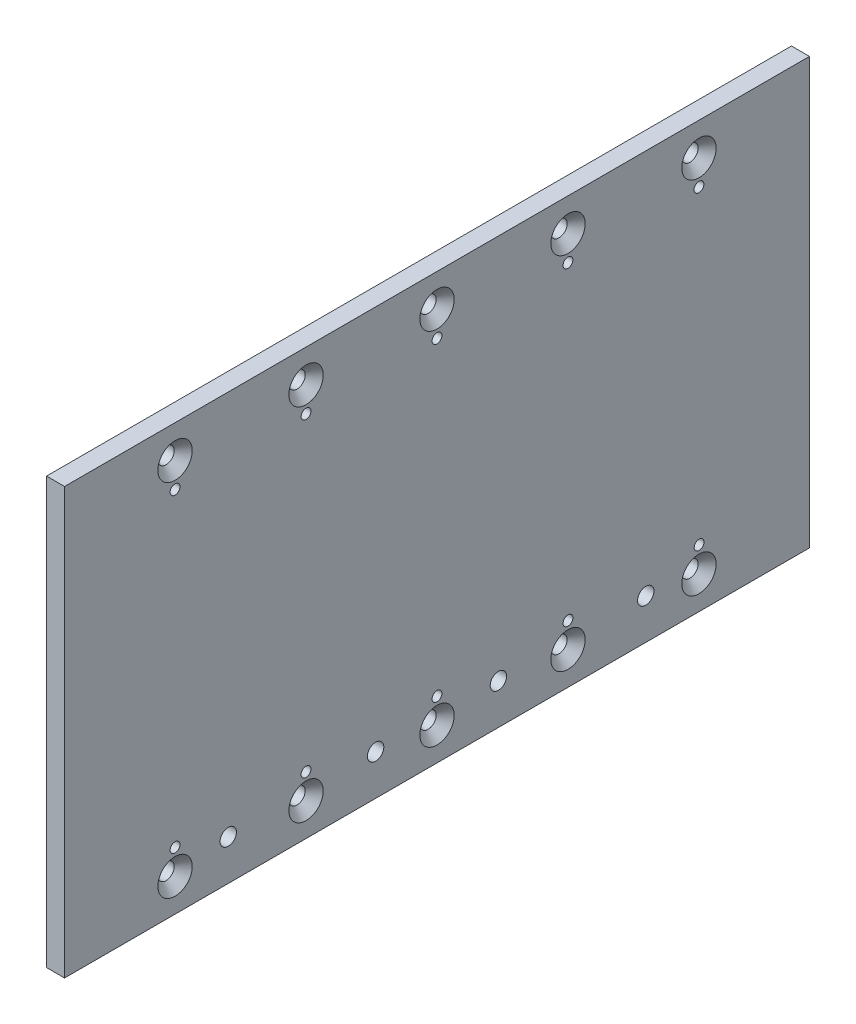
ISO-10303-21;
HEADER;
FILE_DESCRIPTION(('STEP AP214'),'2;1');
FILE_NAME('part.step','',(''),(''),'','','');
FILE_SCHEMA(('AUTOMOTIVE_DESIGN { 1 0 10303 214 1 1 1 1 }'));
ENDSEC;
DATA;
#1=APPLICATION_CONTEXT('core data for automotive mechanical design processes');
#2=APPLICATION_PROTOCOL_DEFINITION('international standard','automotive_design',2000,#1);
#3=PRODUCT_CONTEXT('',#1,'mechanical');
#4=PRODUCT('Part','Part','',(#3));
#5=PRODUCT_RELATED_PRODUCT_CATEGORY('part','',(#4));
#6=PRODUCT_DEFINITION_FORMATION('','',#4);
#7=PRODUCT_DEFINITION_CONTEXT('part definition',#1,'design');
#8=PRODUCT_DEFINITION('design','',#6,#7);
#9=PRODUCT_DEFINITION_SHAPE('','',#8);
#10=(LENGTH_UNIT() NAMED_UNIT(*) SI_UNIT(.MILLI.,.METRE.));
#11=(NAMED_UNIT(*) PLANE_ANGLE_UNIT() SI_UNIT($,.RADIAN.));
#12=(NAMED_UNIT(*) SI_UNIT($,.STERADIAN.) SOLID_ANGLE_UNIT());
#13=UNCERTAINTY_MEASURE_WITH_UNIT(LENGTH_MEASURE(1.E-05),#10,'distance_accuracy_value','');
#14=(GEOMETRIC_REPRESENTATION_CONTEXT(3) GLOBAL_UNCERTAINTY_ASSIGNED_CONTEXT((#13)) GLOBAL_UNIT_ASSIGNED_CONTEXT((#10,
#11,#12)) REPRESENTATION_CONTEXT('',''));
#15=CARTESIAN_POINT('',(0.,0.,0.));
#16=DIRECTION('',(0.,0.,1.));
#17=DIRECTION('',(1.,0.,0.));
#18=AXIS2_PLACEMENT_3D('',#15,#16,#17);
#19=CARTESIAN_POINT('',(5.5,-65.,113.75));
#20=DIRECTION('',(0.,0.,-1.));
#21=DIRECTION('',(-1.,0.,0.));
#22=AXIS2_PLACEMENT_3D('',#19,#20,#21);
#23=PLANE('',#22);
#24=DIRECTION('',(0.,-1.,0.));
#25=VECTOR('',#24,1.);
#26=CARTESIAN_POINT('',(0.,-65.,113.75));
#27=LINE('',#26,#25);
#28=CARTESIAN_POINT('',(0.,65.,113.75));
#29=VERTEX_POINT('',#28);
#30=CARTESIAN_POINT('',(0.,-65.,113.75));
#31=VERTEX_POINT('',#30);
#32=EDGE_CURVE('E108',#29,#31,#27,.T.);
#33=ORIENTED_EDGE('',*,*,#32,.T.);
#34=DIRECTION('',(-1.,0.,0.));
#35=VECTOR('',#34,1.);
#36=CARTESIAN_POINT('',(5.5,-65.,113.75));
#37=LINE('',#36,#35);
#38=CARTESIAN_POINT('',(5.5,-65.,113.75));
#39=VERTEX_POINT('',#38);
#40=EDGE_CURVE('E13',#39,#31,#37,.T.);
#41=ORIENTED_EDGE('',*,*,#40,.F.);
#42=DIRECTION('',(0.,-1.,0.));
#43=VECTOR('',#42,1.);
#44=CARTESIAN_POINT('',(5.5,-65.,113.75));
#45=LINE('',#44,#43);
#46=CARTESIAN_POINT('',(5.5,65.,113.75));
#47=VERTEX_POINT('',#46);
#48=EDGE_CURVE('E96',#47,#39,#45,.T.);
#49=ORIENTED_EDGE('',*,*,#48,.F.);
#50=DIRECTION('',(-1.,0.,0.));
#51=VECTOR('',#50,1.);
#52=CARTESIAN_POINT('',(5.5,65.,113.75));
#53=LINE('',#52,#51);
#54=EDGE_CURVE('E104',#47,#29,#53,.T.);
#55=ORIENTED_EDGE('',*,*,#54,.T.);
#56=EDGE_LOOP('',(#33,#41,#49,#55));
#57=FACE_BOUND('',#56,.T.);
#58=ADVANCED_FACE('F45',(#57),#23,.F.);
#59=CARTESIAN_POINT('',(5.5,-65.,-113.75));
#60=DIRECTION('',(0.,1.,0.));
#61=DIRECTION('',(0.,0.,1.));
#62=AXIS2_PLACEMENT_3D('',#59,#60,#61);
#63=PLANE('',#62);
#64=DIRECTION('',(0.,0.,-1.));
#65=VECTOR('',#64,1.);
#66=CARTESIAN_POINT('',(0.,-65.,-113.75));
#67=LINE('',#66,#65);
#68=CARTESIAN_POINT('',(0.,-65.,-113.75));
#69=VERTEX_POINT('',#68);
#70=EDGE_CURVE('E100',#31,#69,#67,.T.);
#71=ORIENTED_EDGE('',*,*,#70,.T.);
#72=DIRECTION('',(-1.,0.,0.));
#73=VECTOR('',#72,1.);
#74=CARTESIAN_POINT('',(5.5,-65.,-113.75));
#75=LINE('',#74,#73);
#76=CARTESIAN_POINT('',(5.5,-65.,-113.75));
#77=VERTEX_POINT('',#76);
#78=EDGE_CURVE('E53',#77,#69,#75,.T.);
#79=ORIENTED_EDGE('',*,*,#78,.F.);
#80=DIRECTION('',(0.,0.,-1.));
#81=VECTOR('',#80,1.);
#82=CARTESIAN_POINT('',(5.5,-65.,-113.75));
#83=LINE('',#82,#81);
#84=EDGE_CURVE('E91',#39,#77,#83,.T.);
#85=ORIENTED_EDGE('',*,*,#84,.F.);
#86=ORIENTED_EDGE('',*,*,#40,.T.);
#87=EDGE_LOOP('',(#71,#79,#85,#86));
#88=FACE_BOUND('',#87,.T.);
#89=ADVANCED_FACE('F99',(#88),#63,.F.);
#90=CARTESIAN_POINT('',(5.5,-65.,-113.75));
#91=DIRECTION('',(0.,0.,1.));
#92=DIRECTION('',(1.,0.,0.));
#93=AXIS2_PLACEMENT_3D('',#90,#91,#92);
#94=PLANE('',#93);
#95=DIRECTION('',(0.,1.,0.));
#96=VECTOR('',#95,1.);
#97=CARTESIAN_POINT('',(0.,-65.,-113.75));
#98=LINE('',#97,#96);
#99=CARTESIAN_POINT('',(0.,65.,-113.75));
#100=VERTEX_POINT('',#99);
#101=EDGE_CURVE('E78',#69,#100,#98,.T.);
#102=ORIENTED_EDGE('',*,*,#101,.T.);
#103=DIRECTION('',(-1.,0.,0.));
#104=VECTOR('',#103,1.);
#105=CARTESIAN_POINT('',(5.5,65.,-113.75));
#106=LINE('',#105,#104);
#107=CARTESIAN_POINT('',(5.5,65.,-113.75));
#108=VERTEX_POINT('',#107);
#109=EDGE_CURVE('E101',#108,#100,#106,.T.);
#110=ORIENTED_EDGE('',*,*,#109,.F.);
#111=DIRECTION('',(0.,1.,0.));
#112=VECTOR('',#111,1.);
#113=CARTESIAN_POINT('',(5.5,-65.,-113.75));
#114=LINE('',#113,#112);
#115=EDGE_CURVE('E94',#77,#108,#114,.T.);
#116=ORIENTED_EDGE('',*,*,#115,.F.);
#117=ORIENTED_EDGE('',*,*,#78,.T.);
#118=EDGE_LOOP('',(#102,#110,#116,#117));
#119=FACE_BOUND('',#118,.T.);
#120=ADVANCED_FACE('F102',(#119),#94,.F.);
#121=CARTESIAN_POINT('',(5.5,65.,-113.75));
#122=DIRECTION('',(0.,-1.,0.));
#123=DIRECTION('',(0.,0.,-1.));
#124=AXIS2_PLACEMENT_3D('',#121,#122,#123);
#125=PLANE('',#124);
#126=DIRECTION('',(0.,0.,1.));
#127=VECTOR('',#126,1.);
#128=CARTESIAN_POINT('',(0.,65.,-113.75));
#129=LINE('',#128,#127);
#130=EDGE_CURVE('E84',#100,#29,#129,.T.);
#131=ORIENTED_EDGE('',*,*,#130,.T.);
#132=ORIENTED_EDGE('',*,*,#54,.F.);
#133=DIRECTION('',(0.,0.,1.));
#134=VECTOR('',#133,1.);
#135=CARTESIAN_POINT('',(5.5,65.,-113.75));
#136=LINE('',#135,#134);
#137=EDGE_CURVE('E61',#108,#47,#136,.T.);
#138=ORIENTED_EDGE('',*,*,#137,.F.);
#139=ORIENTED_EDGE('',*,*,#109,.T.);
#140=EDGE_LOOP('',(#131,#132,#138,#139));
#141=FACE_BOUND('',#140,.T.);
#142=ADVANCED_FACE('F116',(#141),#125,.F.);
#143=CARTESIAN_POINT('',(5.5,0.,0.));
#144=DIRECTION('',(1.,0.,0.));
#145=DIRECTION('',(0.,0.,-1.));
#146=AXIS2_PLACEMENT_3D('',#143,#144,#145);
#147=PLANE('',#146);
#148=CARTESIAN_POINT('',(5.5,47.3325000000011,80.));
#149=DIRECTION('',(1.,0.,0.));
#150=DIRECTION('',(0.,0.,-1.));
#151=AXIS2_PLACEMENT_3D('',#148,#149,#150);
#152=CIRCLE('',#151,1.50000000000003);
#153=CARTESIAN_POINT('',(5.5,47.3325000000011,78.5));
#154=VERTEX_POINT('',#153);
#155=EDGE_CURVE('E289',#154,#154,#152,.T.);
#156=ORIENTED_EDGE('',*,*,#155,.F.);
#157=EDGE_LOOP('',(#156));
#158=FACE_BOUND('',#157,.T.);
#159=CARTESIAN_POINT('',(5.5,47.3325000000008,40.));
#160=DIRECTION('',(1.,0.,0.));
#161=DIRECTION('',(0.,0.,-1.));
#162=AXIS2_PLACEMENT_3D('',#159,#160,#161);
#163=CIRCLE('',#162,1.50000000000003);
#164=CARTESIAN_POINT('',(5.5,47.3325000000008,38.5));
#165=VERTEX_POINT('',#164);
#166=EDGE_CURVE('E283',#165,#165,#163,.T.);
#167=ORIENTED_EDGE('',*,*,#166,.F.);
#168=EDGE_LOOP('',(#167));
#169=FACE_BOUND('',#168,.T.);
#170=CARTESIAN_POINT('',(5.5,47.3325000000006,0.));
#171=DIRECTION('',(1.,0.,0.));
#172=DIRECTION('',(0.,0.,-1.));
#173=AXIS2_PLACEMENT_3D('',#170,#171,#172);
#174=CIRCLE('',#173,1.50000000000002);
#175=CARTESIAN_POINT('',(5.5,47.3325000000006,-1.50000000000001));
#176=VERTEX_POINT('',#175);
#177=EDGE_CURVE('E277',#176,#176,#174,.T.);
#178=ORIENTED_EDGE('',*,*,#177,.F.);
#179=EDGE_LOOP('',(#178));
#180=FACE_BOUND('',#179,.T.);
#181=CARTESIAN_POINT('',(5.5,47.3325000000003,-40.));
#182=DIRECTION('',(1.,0.,0.));
#183=DIRECTION('',(0.,0.,-1.));
#184=AXIS2_PLACEMENT_3D('',#181,#182,#183);
#185=CIRCLE('',#184,1.50000000000003);
#186=CARTESIAN_POINT('',(5.5,47.3325000000003,-41.5));
#187=VERTEX_POINT('',#186);
#188=EDGE_CURVE('E271',#187,#187,#185,.T.);
#189=ORIENTED_EDGE('',*,*,#188,.F.);
#190=EDGE_LOOP('',(#189));
#191=FACE_BOUND('',#190,.T.);
#192=CARTESIAN_POINT('',(5.5,47.3325,-80.));
#193=DIRECTION('',(1.,0.,0.));
#194=DIRECTION('',(0.,0.,-1.));
#195=AXIS2_PLACEMENT_3D('',#192,#193,#194);
#196=CIRCLE('',#195,1.50000000000003);
#197=CARTESIAN_POINT('',(5.5,47.3325,-81.5));
#198=VERTEX_POINT('',#197);
#199=EDGE_CURVE('E265',#198,#198,#196,.T.);
#200=ORIENTED_EDGE('',*,*,#199,.F.);
#201=EDGE_LOOP('',(#200));
#202=FACE_BOUND('',#201,.T.);
#203=CARTESIAN_POINT('',(5.5,-47.3325,80.));
#204=DIRECTION('',(1.,0.,0.));
#205=DIRECTION('',(0.,0.,-1.));
#206=AXIS2_PLACEMENT_3D('',#203,#204,#205);
#207=CIRCLE('',#206,1.5);
#208=CARTESIAN_POINT('',(5.5,-47.3325,78.5));
#209=VERTEX_POINT('',#208);
#210=EDGE_CURVE('E259',#209,#209,#207,.T.);
#211=ORIENTED_EDGE('',*,*,#210,.F.);
#212=EDGE_LOOP('',(#211));
#213=FACE_BOUND('',#212,.T.);
#214=CARTESIAN_POINT('',(5.5,-47.3325,40.));
#215=DIRECTION('',(1.,0.,0.));
#216=DIRECTION('',(0.,0.,-1.));
#217=AXIS2_PLACEMENT_3D('',#214,#215,#216);
#218=CIRCLE('',#217,1.50000000000003);
#219=CARTESIAN_POINT('',(5.5,-47.3325,38.5));
#220=VERTEX_POINT('',#219);
#221=EDGE_CURVE('E253',#220,#220,#218,.T.);
#222=ORIENTED_EDGE('',*,*,#221,.F.);
#223=EDGE_LOOP('',(#222));
#224=FACE_BOUND('',#223,.T.);
#225=CARTESIAN_POINT('',(5.5,-47.3325,0.));
#226=DIRECTION('',(1.,0.,0.));
#227=DIRECTION('',(0.,0.,-1.));
#228=AXIS2_PLACEMENT_3D('',#225,#226,#227);
#229=CIRCLE('',#228,1.5);
#230=CARTESIAN_POINT('',(5.5,-47.3325,-1.5));
#231=VERTEX_POINT('',#230);
#232=EDGE_CURVE('E247',#231,#231,#229,.T.);
#233=ORIENTED_EDGE('',*,*,#232,.F.);
#234=EDGE_LOOP('',(#233));
#235=FACE_BOUND('',#234,.T.);
#236=CARTESIAN_POINT('',(5.5,-47.3325,-40.));
#237=DIRECTION('',(1.,0.,0.));
#238=DIRECTION('',(0.,0.,-1.));
#239=AXIS2_PLACEMENT_3D('',#236,#237,#238);
#240=CIRCLE('',#239,1.5);
#241=CARTESIAN_POINT('',(5.5,-47.3325,-41.5));
#242=VERTEX_POINT('',#241);
#243=EDGE_CURVE('E241',#242,#242,#240,.T.);
#244=ORIENTED_EDGE('',*,*,#243,.F.);
#245=EDGE_LOOP('',(#244));
#246=FACE_BOUND('',#245,.T.);
#247=CARTESIAN_POINT('',(5.5,-47.3325,-80.045792535828));
#248=DIRECTION('',(1.,0.,0.));
#249=DIRECTION('',(0.,0.,-1.));
#250=AXIS2_PLACEMENT_3D('',#247,#248,#249);
#251=CIRCLE('',#250,1.5);
#252=CARTESIAN_POINT('',(5.5,-47.3325,-81.545792535828));
#253=VERTEX_POINT('',#252);
#254=EDGE_CURVE('E235',#253,#253,#251,.T.);
#255=ORIENTED_EDGE('',*,*,#254,.F.);
#256=EDGE_LOOP('',(#255));
#257=FACE_BOUND('',#256,.T.);
#258=CARTESIAN_POINT('',(5.5,-52.6538368417559,63.75));
#259=DIRECTION('',(1.,0.,0.));
#260=DIRECTION('',(0.,0.,-1.));
#261=AXIS2_PLACEMENT_3D('',#258,#259,#260);
#262=CIRCLE('',#261,2.49999999999999);
#263=CARTESIAN_POINT('',(5.5,-52.6538368417559,61.25));
#264=VERTEX_POINT('',#263);
#265=EDGE_CURVE('E232',#264,#264,#262,.T.);
#266=ORIENTED_EDGE('',*,*,#265,.F.);
#267=EDGE_LOOP('',(#266));
#268=FACE_BOUND('',#267,.T.);
#269=CARTESIAN_POINT('',(5.5,-52.6538368417559,18.75));
#270=DIRECTION('',(1.,0.,0.));
#271=DIRECTION('',(0.,0.,-1.));
#272=AXIS2_PLACEMENT_3D('',#269,#270,#271);
#273=CIRCLE('',#272,2.49999999999999);
#274=CARTESIAN_POINT('',(5.5,-52.6538368417559,16.2500000000001));
#275=VERTEX_POINT('',#274);
#276=EDGE_CURVE('E226',#275,#275,#273,.T.);
#277=ORIENTED_EDGE('',*,*,#276,.F.);
#278=EDGE_LOOP('',(#277));
#279=FACE_BOUND('',#278,.T.);
#280=CARTESIAN_POINT('',(5.5,-52.6538368417559,-18.75));
#281=DIRECTION('',(1.,0.,0.));
#282=DIRECTION('',(0.,0.,-1.));
#283=AXIS2_PLACEMENT_3D('',#280,#281,#282);
#284=CIRCLE('',#283,2.49999999999999);
#285=CARTESIAN_POINT('',(5.5,-52.6538368417559,-21.25));
#286=VERTEX_POINT('',#285);
#287=EDGE_CURVE('E220',#286,#286,#284,.T.);
#288=ORIENTED_EDGE('',*,*,#287,.F.);
#289=EDGE_LOOP('',(#288));
#290=FACE_BOUND('',#289,.T.);
#291=CARTESIAN_POINT('',(5.5,-52.6538368417559,-63.75));
#292=DIRECTION('',(1.,0.,0.));
#293=DIRECTION('',(0.,0.,-1.));
#294=AXIS2_PLACEMENT_3D('',#291,#292,#293);
#295=CIRCLE('',#294,2.49999999999999);
#296=CARTESIAN_POINT('',(5.5,-52.6538368417559,-66.2499999999999));
#297=VERTEX_POINT('',#296);
#298=EDGE_CURVE('E214',#297,#297,#295,.T.);
#299=ORIENTED_EDGE('',*,*,#298,.F.);
#300=EDGE_LOOP('',(#299));
#301=FACE_BOUND('',#300,.T.);
#302=CARTESIAN_POINT('',(5.5,55.,-80.));
#303=DIRECTION('',(1.,0.,0.));
#304=DIRECTION('',(0.,0.,-1.));
#305=AXIS2_PLACEMENT_3D('',#302,#303,#304);
#306=CIRCLE('',#305,5.25);
#307=CARTESIAN_POINT('',(5.5,55.,-85.25));
#308=VERTEX_POINT('',#307);
#309=EDGE_CURVE('E208',#308,#308,#306,.T.);
#310=ORIENTED_EDGE('',*,*,#309,.F.);
#311=EDGE_LOOP('',(#310));
#312=FACE_BOUND('',#311,.T.);
#313=CARTESIAN_POINT('',(5.5,55.,-40.));
#314=DIRECTION('',(1.,0.,0.));
#315=DIRECTION('',(0.,0.,-1.));
#316=AXIS2_PLACEMENT_3D('',#313,#314,#315);
#317=CIRCLE('',#316,5.25);
#318=CARTESIAN_POINT('',(5.5,55.,-45.25));
#319=VERTEX_POINT('',#318);
#320=EDGE_CURVE('E199',#319,#319,#317,.T.);
#321=ORIENTED_EDGE('',*,*,#320,.F.);
#322=EDGE_LOOP('',(#321));
#323=FACE_BOUND('',#322,.T.);
#324=CARTESIAN_POINT('',(5.5,55.,0.));
#325=DIRECTION('',(1.,0.,0.));
#326=DIRECTION('',(0.,0.,-1.));
#327=AXIS2_PLACEMENT_3D('',#324,#325,#326);
#328=CIRCLE('',#327,5.25);
#329=CARTESIAN_POINT('',(5.5,55.,-5.25));
#330=VERTEX_POINT('',#329);
#331=EDGE_CURVE('E190',#330,#330,#328,.T.);
#332=ORIENTED_EDGE('',*,*,#331,.F.);
#333=EDGE_LOOP('',(#332));
#334=FACE_BOUND('',#333,.T.);
#335=CARTESIAN_POINT('',(5.5,54.9999999999999,40.));
#336=DIRECTION('',(1.,0.,0.));
#337=DIRECTION('',(0.,0.,-1.));
#338=AXIS2_PLACEMENT_3D('',#335,#336,#337);
#339=CIRCLE('',#338,5.25);
#340=CARTESIAN_POINT('',(5.5,54.9999999999999,34.75));
#341=VERTEX_POINT('',#340);
#342=EDGE_CURVE('E181',#341,#341,#339,.T.);
#343=ORIENTED_EDGE('',*,*,#342,.F.);
#344=EDGE_LOOP('',(#343));
#345=FACE_BOUND('',#344,.T.);
#346=CARTESIAN_POINT('',(5.5,54.9999999999999,80.));
#347=DIRECTION('',(1.,0.,0.));
#348=DIRECTION('',(0.,0.,-1.));
#349=AXIS2_PLACEMENT_3D('',#346,#347,#348);
#350=CIRCLE('',#349,5.25);
#351=CARTESIAN_POINT('',(5.5,54.9999999999999,74.75));
#352=VERTEX_POINT('',#351);
#353=EDGE_CURVE('E172',#352,#352,#350,.T.);
#354=ORIENTED_EDGE('',*,*,#353,.F.);
#355=EDGE_LOOP('',(#354));
#356=FACE_BOUND('',#355,.T.);
#357=CARTESIAN_POINT('',(5.5,-55.0000000000001,80.));
#358=DIRECTION('',(1.,0.,0.));
#359=DIRECTION('',(0.,0.,-1.));
#360=AXIS2_PLACEMENT_3D('',#357,#358,#359);
#361=CIRCLE('',#360,5.25);
#362=CARTESIAN_POINT('',(5.5,-55.0000000000001,74.75));
#363=VERTEX_POINT('',#362);
#364=EDGE_CURVE('E163',#363,#363,#361,.T.);
#365=ORIENTED_EDGE('',*,*,#364,.F.);
#366=EDGE_LOOP('',(#365));
#367=FACE_BOUND('',#366,.T.);
#368=CARTESIAN_POINT('',(5.5,-55.0000000000001,40.));
#369=DIRECTION('',(1.,0.,0.));
#370=DIRECTION('',(0.,0.,-1.));
#371=AXIS2_PLACEMENT_3D('',#368,#369,#370);
#372=CIRCLE('',#371,5.25);
#373=CARTESIAN_POINT('',(5.5,-55.0000000000001,34.75));
#374=VERTEX_POINT('',#373);
#375=EDGE_CURVE('E154',#374,#374,#372,.T.);
#376=ORIENTED_EDGE('',*,*,#375,.F.);
#377=EDGE_LOOP('',(#376));
#378=FACE_BOUND('',#377,.T.);
#379=CARTESIAN_POINT('',(5.5,-55.0000000000001,0.));
#380=DIRECTION('',(1.,0.,0.));
#381=DIRECTION('',(0.,0.,-1.));
#382=AXIS2_PLACEMENT_3D('',#379,#380,#381);
#383=CIRCLE('',#382,5.25);
#384=CARTESIAN_POINT('',(5.5,-55.0000000000001,-5.25000000000001));
#385=VERTEX_POINT('',#384);
#386=EDGE_CURVE('E145',#385,#385,#383,.T.);
#387=ORIENTED_EDGE('',*,*,#386,.F.);
#388=EDGE_LOOP('',(#387));
#389=FACE_BOUND('',#388,.T.);
#390=CARTESIAN_POINT('',(5.5,-55.,-40.));
#391=DIRECTION('',(1.,0.,0.));
#392=DIRECTION('',(0.,0.,-1.));
#393=AXIS2_PLACEMENT_3D('',#390,#391,#392);
#394=CIRCLE('',#393,5.25);
#395=CARTESIAN_POINT('',(5.5,-55.,-45.25));
#396=VERTEX_POINT('',#395);
#397=EDGE_CURVE('E136',#396,#396,#394,.T.);
#398=ORIENTED_EDGE('',*,*,#397,.F.);
#399=EDGE_LOOP('',(#398));
#400=FACE_BOUND('',#399,.T.);
#401=CARTESIAN_POINT('',(5.5,-55.,-80.));
#402=DIRECTION('',(1.,0.,0.));
#403=DIRECTION('',(0.,0.,-1.));
#404=AXIS2_PLACEMENT_3D('',#401,#402,#403);
#405=CIRCLE('',#404,5.25);
#406=CARTESIAN_POINT('',(5.5,-55.,-85.25));
#407=VERTEX_POINT('',#406);
#408=EDGE_CURVE('E127',#407,#407,#405,.T.);
#409=ORIENTED_EDGE('',*,*,#408,.F.);
#410=EDGE_LOOP('',(#409));
#411=FACE_BOUND('',#410,.T.);
#412=ORIENTED_EDGE('',*,*,#48,.T.);
#413=ORIENTED_EDGE('',*,*,#84,.T.);
#414=ORIENTED_EDGE('',*,*,#115,.T.);
#415=ORIENTED_EDGE('',*,*,#137,.T.);
#416=EDGE_LOOP('',(#412,#413,#414,#415));
#417=FACE_BOUND('',#416,.T.);
#418=ADVANCED_FACE('F92',(#158,#169,#180,#191,#202,#213,#224,#235,#246,#257,#268,#279,#290,#301,
#312,#323,#334,#345,#356,#367,#378,#389,#400,#411,#417),#147,.T.);
#419=CARTESIAN_POINT('',(0.,0.,0.));
#420=DIRECTION('',(1.,0.,0.));
#421=DIRECTION('',(0.,0.,-1.));
#422=AXIS2_PLACEMENT_3D('',#419,#420,#421);
#423=PLANE('',#422);
#424=CARTESIAN_POINT('',(0.,47.3325000000011,80.));
#425=DIRECTION('',(-1.,0.,0.));
#426=DIRECTION('',(0.,0.,1.));
#427=AXIS2_PLACEMENT_3D('',#424,#425,#426);
#428=CIRCLE('',#427,1.50000000000003);
#429=CARTESIAN_POINT('',(0.,47.3325000000011,81.5));
#430=VERTEX_POINT('',#429);
#431=EDGE_CURVE('E292',#430,#430,#428,.T.);
#432=ORIENTED_EDGE('',*,*,#431,.F.);
#433=EDGE_LOOP('',(#432));
#434=FACE_BOUND('',#433,.T.);
#435=CARTESIAN_POINT('',(0.,47.3325000000008,40.));
#436=DIRECTION('',(-1.,0.,0.));
#437=DIRECTION('',(0.,0.,1.));
#438=AXIS2_PLACEMENT_3D('',#435,#436,#437);
#439=CIRCLE('',#438,1.50000000000003);
#440=CARTESIAN_POINT('',(0.,47.3325000000008,41.5));
#441=VERTEX_POINT('',#440);
#442=EDGE_CURVE('E286',#441,#441,#439,.T.);
#443=ORIENTED_EDGE('',*,*,#442,.F.);
#444=EDGE_LOOP('',(#443));
#445=FACE_BOUND('',#444,.T.);
#446=CARTESIAN_POINT('',(0.,47.3325000000006,0.));
#447=DIRECTION('',(-1.,0.,0.));
#448=DIRECTION('',(0.,0.,1.));
#449=AXIS2_PLACEMENT_3D('',#446,#447,#448);
#450=CIRCLE('',#449,1.50000000000002);
#451=CARTESIAN_POINT('',(0.,47.3325000000006,1.50000000000004));
#452=VERTEX_POINT('',#451);
#453=EDGE_CURVE('E280',#452,#452,#450,.T.);
#454=ORIENTED_EDGE('',*,*,#453,.F.);
#455=EDGE_LOOP('',(#454));
#456=FACE_BOUND('',#455,.T.);
#457=CARTESIAN_POINT('',(0.,47.3325000000003,-40.));
#458=DIRECTION('',(-1.,0.,0.));
#459=DIRECTION('',(0.,0.,1.));
#460=AXIS2_PLACEMENT_3D('',#457,#458,#459);
#461=CIRCLE('',#460,1.50000000000003);
#462=CARTESIAN_POINT('',(0.,47.3325000000003,-38.5));
#463=VERTEX_POINT('',#462);
#464=EDGE_CURVE('E274',#463,#463,#461,.T.);
#465=ORIENTED_EDGE('',*,*,#464,.F.);
#466=EDGE_LOOP('',(#465));
#467=FACE_BOUND('',#466,.T.);
#468=CARTESIAN_POINT('',(0.,47.3325,-80.));
#469=DIRECTION('',(-1.,0.,0.));
#470=DIRECTION('',(0.,0.,1.));
#471=AXIS2_PLACEMENT_3D('',#468,#469,#470);
#472=CIRCLE('',#471,1.50000000000003);
#473=CARTESIAN_POINT('',(0.,47.3325,-78.5));
#474=VERTEX_POINT('',#473);
#475=EDGE_CURVE('E268',#474,#474,#472,.T.);
#476=ORIENTED_EDGE('',*,*,#475,.F.);
#477=EDGE_LOOP('',(#476));
#478=FACE_BOUND('',#477,.T.);
#479=CARTESIAN_POINT('',(0.,-47.3325,80.));
#480=DIRECTION('',(-1.,0.,0.));
#481=DIRECTION('',(0.,0.,1.));
#482=AXIS2_PLACEMENT_3D('',#479,#480,#481);
#483=CIRCLE('',#482,1.5);
#484=CARTESIAN_POINT('',(0.,-47.3325,81.5));
#485=VERTEX_POINT('',#484);
#486=EDGE_CURVE('E262',#485,#485,#483,.T.);
#487=ORIENTED_EDGE('',*,*,#486,.F.);
#488=EDGE_LOOP('',(#487));
#489=FACE_BOUND('',#488,.T.);
#490=CARTESIAN_POINT('',(0.,-47.3325,40.));
#491=DIRECTION('',(-1.,0.,0.));
#492=DIRECTION('',(0.,0.,1.));
#493=AXIS2_PLACEMENT_3D('',#490,#491,#492);
#494=CIRCLE('',#493,1.50000000000003);
#495=CARTESIAN_POINT('',(0.,-47.3325,41.5));
#496=VERTEX_POINT('',#495);
#497=EDGE_CURVE('E256',#496,#496,#494,.T.);
#498=ORIENTED_EDGE('',*,*,#497,.F.);
#499=EDGE_LOOP('',(#498));
#500=FACE_BOUND('',#499,.T.);
#501=CARTESIAN_POINT('',(0.,-47.3325,0.));
#502=DIRECTION('',(-1.,0.,0.));
#503=DIRECTION('',(0.,0.,1.));
#504=AXIS2_PLACEMENT_3D('',#501,#502,#503);
#505=CIRCLE('',#504,1.5);
#506=CARTESIAN_POINT('',(0.,-47.3325,1.5));
#507=VERTEX_POINT('',#506);
#508=EDGE_CURVE('E250',#507,#507,#505,.T.);
#509=ORIENTED_EDGE('',*,*,#508,.F.);
#510=EDGE_LOOP('',(#509));
#511=FACE_BOUND('',#510,.T.);
#512=CARTESIAN_POINT('',(0.,-47.3325,-40.));
#513=DIRECTION('',(-1.,0.,0.));
#514=DIRECTION('',(0.,0.,1.));
#515=AXIS2_PLACEMENT_3D('',#512,#513,#514);
#516=CIRCLE('',#515,1.5);
#517=CARTESIAN_POINT('',(0.,-47.3325,-38.5));
#518=VERTEX_POINT('',#517);
#519=EDGE_CURVE('E244',#518,#518,#516,.T.);
#520=ORIENTED_EDGE('',*,*,#519,.F.);
#521=EDGE_LOOP('',(#520));
#522=FACE_BOUND('',#521,.T.);
#523=CARTESIAN_POINT('',(0.,-47.3325,-80.045792535828));
#524=DIRECTION('',(-1.,0.,0.));
#525=DIRECTION('',(0.,0.,1.));
#526=AXIS2_PLACEMENT_3D('',#523,#524,#525);
#527=CIRCLE('',#526,1.5);
#528=CARTESIAN_POINT('',(0.,-47.3325,-78.545792535828));
#529=VERTEX_POINT('',#528);
#530=EDGE_CURVE('E238',#529,#529,#527,.T.);
#531=ORIENTED_EDGE('',*,*,#530,.F.);
#532=EDGE_LOOP('',(#531));
#533=FACE_BOUND('',#532,.T.);
#534=CARTESIAN_POINT('',(0.,-52.6538368417559,63.75));
#535=DIRECTION('',(1.,0.,0.));
#536=DIRECTION('',(0.,0.,-1.));
#537=AXIS2_PLACEMENT_3D('',#534,#535,#536);
#538=CIRCLE('',#537,2.49999999999999);
#539=CARTESIAN_POINT('',(0.,-52.6538368417559,61.25));
#540=VERTEX_POINT('',#539);
#541=EDGE_CURVE('E229',#540,#540,#538,.T.);
#542=ORIENTED_EDGE('',*,*,#541,.T.);
#543=EDGE_LOOP('',(#542));
#544=FACE_BOUND('',#543,.T.);
#545=CARTESIAN_POINT('',(0.,-52.6538368417559,18.75));
#546=DIRECTION('',(1.,0.,0.));
#547=DIRECTION('',(0.,0.,-1.));
#548=AXIS2_PLACEMENT_3D('',#545,#546,#547);
#549=CIRCLE('',#548,2.49999999999999);
#550=CARTESIAN_POINT('',(0.,-52.6538368417559,16.2500000000001));
#551=VERTEX_POINT('',#550);
#552=EDGE_CURVE('E223',#551,#551,#549,.T.);
#553=ORIENTED_EDGE('',*,*,#552,.T.);
#554=EDGE_LOOP('',(#553));
#555=FACE_BOUND('',#554,.T.);
#556=CARTESIAN_POINT('',(0.,-52.6538368417559,-18.75));
#557=DIRECTION('',(1.,0.,0.));
#558=DIRECTION('',(0.,0.,-1.));
#559=AXIS2_PLACEMENT_3D('',#556,#557,#558);
#560=CIRCLE('',#559,2.49999999999999);
#561=CARTESIAN_POINT('',(0.,-52.6538368417559,-21.25));
#562=VERTEX_POINT('',#561);
#563=EDGE_CURVE('E217',#562,#562,#560,.T.);
#564=ORIENTED_EDGE('',*,*,#563,.T.);
#565=EDGE_LOOP('',(#564));
#566=FACE_BOUND('',#565,.T.);
#567=CARTESIAN_POINT('',(0.,-52.6538368417559,-63.75));
#568=DIRECTION('',(1.,0.,0.));
#569=DIRECTION('',(0.,0.,-1.));
#570=AXIS2_PLACEMENT_3D('',#567,#568,#569);
#571=CIRCLE('',#570,2.49999999999999);
#572=CARTESIAN_POINT('',(0.,-52.6538368417559,-66.2499999999999));
#573=VERTEX_POINT('',#572);
#574=EDGE_CURVE('E211',#573,#573,#571,.T.);
#575=ORIENTED_EDGE('',*,*,#574,.T.);
#576=EDGE_LOOP('',(#575));
#577=FACE_BOUND('',#576,.T.);
#578=CARTESIAN_POINT('',(0.,55.,-80.));
#579=DIRECTION('',(1.,0.,0.));
#580=DIRECTION('',(0.,0.,-1.));
#581=AXIS2_PLACEMENT_3D('',#578,#579,#580);
#582=CIRCLE('',#581,2.5);
#583=CARTESIAN_POINT('',(0.,55.,-82.5));
#584=VERTEX_POINT('',#583);
#585=EDGE_CURVE('E202',#584,#584,#582,.T.);
#586=ORIENTED_EDGE('',*,*,#585,.T.);
#587=EDGE_LOOP('',(#586));
#588=FACE_BOUND('',#587,.T.);
#589=CARTESIAN_POINT('',(0.,55.,-40.));
#590=DIRECTION('',(1.,0.,0.));
#591=DIRECTION('',(0.,0.,-1.));
#592=AXIS2_PLACEMENT_3D('',#589,#590,#591);
#593=CIRCLE('',#592,2.5);
#594=CARTESIAN_POINT('',(0.,55.,-42.5));
#595=VERTEX_POINT('',#594);
#596=EDGE_CURVE('E193',#595,#595,#593,.T.);
#597=ORIENTED_EDGE('',*,*,#596,.T.);
#598=EDGE_LOOP('',(#597));
#599=FACE_BOUND('',#598,.T.);
#600=CARTESIAN_POINT('',(0.,55.,0.));
#601=DIRECTION('',(1.,0.,0.));
#602=DIRECTION('',(0.,0.,-1.));
#603=AXIS2_PLACEMENT_3D('',#600,#601,#602);
#604=CIRCLE('',#603,2.5);
#605=CARTESIAN_POINT('',(0.,55.,-2.5));
#606=VERTEX_POINT('',#605);
#607=EDGE_CURVE('E184',#606,#606,#604,.T.);
#608=ORIENTED_EDGE('',*,*,#607,.T.);
#609=EDGE_LOOP('',(#608));
#610=FACE_BOUND('',#609,.T.);
#611=CARTESIAN_POINT('',(0.,54.9999999999999,40.));
#612=DIRECTION('',(1.,0.,0.));
#613=DIRECTION('',(0.,0.,-1.));
#614=AXIS2_PLACEMENT_3D('',#611,#612,#613);
#615=CIRCLE('',#614,2.5);
#616=CARTESIAN_POINT('',(0.,54.9999999999999,37.5));
#617=VERTEX_POINT('',#616);
#618=EDGE_CURVE('E175',#617,#617,#615,.T.);
#619=ORIENTED_EDGE('',*,*,#618,.T.);
#620=EDGE_LOOP('',(#619));
#621=FACE_BOUND('',#620,.T.);
#622=CARTESIAN_POINT('',(0.,54.9999999999999,80.));
#623=DIRECTION('',(1.,0.,0.));
#624=DIRECTION('',(0.,0.,-1.));
#625=AXIS2_PLACEMENT_3D('',#622,#623,#624);
#626=CIRCLE('',#625,2.5);
#627=CARTESIAN_POINT('',(0.,54.9999999999999,77.5));
#628=VERTEX_POINT('',#627);
#629=EDGE_CURVE('E166',#628,#628,#626,.T.);
#630=ORIENTED_EDGE('',*,*,#629,.T.);
#631=EDGE_LOOP('',(#630));
#632=FACE_BOUND('',#631,.T.);
#633=CARTESIAN_POINT('',(0.,-55.0000000000001,80.));
#634=DIRECTION('',(1.,0.,0.));
#635=DIRECTION('',(0.,0.,-1.));
#636=AXIS2_PLACEMENT_3D('',#633,#634,#635);
#637=CIRCLE('',#636,2.5);
#638=CARTESIAN_POINT('',(0.,-55.0000000000001,77.5));
#639=VERTEX_POINT('',#638);
#640=EDGE_CURVE('E157',#639,#639,#637,.T.);
#641=ORIENTED_EDGE('',*,*,#640,.T.);
#642=EDGE_LOOP('',(#641));
#643=FACE_BOUND('',#642,.T.);
#644=CARTESIAN_POINT('',(0.,-55.0000000000001,40.));
#645=DIRECTION('',(1.,0.,0.));
#646=DIRECTION('',(0.,0.,-1.));
#647=AXIS2_PLACEMENT_3D('',#644,#645,#646);
#648=CIRCLE('',#647,2.5);
#649=CARTESIAN_POINT('',(0.,-55.0000000000001,37.5));
#650=VERTEX_POINT('',#649);
#651=EDGE_CURVE('E148',#650,#650,#648,.T.);
#652=ORIENTED_EDGE('',*,*,#651,.T.);
#653=EDGE_LOOP('',(#652));
#654=FACE_BOUND('',#653,.T.);
#655=CARTESIAN_POINT('',(0.,-55.0000000000001,0.));
#656=DIRECTION('',(1.,0.,0.));
#657=DIRECTION('',(0.,0.,-1.));
#658=AXIS2_PLACEMENT_3D('',#655,#656,#657);
#659=CIRCLE('',#658,2.5);
#660=CARTESIAN_POINT('',(0.,-55.0000000000001,-2.50000000000001));
#661=VERTEX_POINT('',#660);
#662=EDGE_CURVE('E139',#661,#661,#659,.T.);
#663=ORIENTED_EDGE('',*,*,#662,.T.);
#664=EDGE_LOOP('',(#663));
#665=FACE_BOUND('',#664,.T.);
#666=CARTESIAN_POINT('',(0.,-55.,-40.));
#667=DIRECTION('',(1.,0.,0.));
#668=DIRECTION('',(0.,0.,-1.));
#669=AXIS2_PLACEMENT_3D('',#666,#667,#668);
#670=CIRCLE('',#669,2.5);
#671=CARTESIAN_POINT('',(0.,-55.,-42.5));
#672=VERTEX_POINT('',#671);
#673=EDGE_CURVE('E130',#672,#672,#670,.T.);
#674=ORIENTED_EDGE('',*,*,#673,.T.);
#675=EDGE_LOOP('',(#674));
#676=FACE_BOUND('',#675,.T.);
#677=CARTESIAN_POINT('',(0.,-55.,-80.));
#678=DIRECTION('',(1.,0.,0.));
#679=DIRECTION('',(0.,0.,-1.));
#680=AXIS2_PLACEMENT_3D('',#677,#678,#679);
#681=CIRCLE('',#680,2.5);
#682=CARTESIAN_POINT('',(0.,-55.,-82.5));
#683=VERTEX_POINT('',#682);
#684=EDGE_CURVE('E111',#683,#683,#681,.T.);
#685=ORIENTED_EDGE('',*,*,#684,.T.);
#686=EDGE_LOOP('',(#685));
#687=FACE_BOUND('',#686,.T.);
#688=ORIENTED_EDGE('',*,*,#32,.F.);
#689=ORIENTED_EDGE('',*,*,#130,.F.);
#690=ORIENTED_EDGE('',*,*,#101,.F.);
#691=ORIENTED_EDGE('',*,*,#70,.F.);
#692=EDGE_LOOP('',(#688,#689,#690,#691));
#693=FACE_BOUND('',#692,.T.);
#694=ADVANCED_FACE('F119',(#434,#445,#456,#467,#478,#489,#500,#511,#522,#533,#544,#555,#566,
#577,#588,#599,#610,#621,#632,#643,#654,#665,#676,#687,#693),#423,.F.);
#695=CARTESIAN_POINT('',(5.5,-55.,-80.));
#696=DIRECTION('',(1.,0.,0.));
#697=DIRECTION('',(0.,0.,-1.));
#698=AXIS2_PLACEMENT_3D('',#695,#696,#697);
#699=CYLINDRICAL_SURFACE('',#698,2.5);
#700=ORIENTED_EDGE('',*,*,#684,.F.);
#701=EDGE_LOOP('',(#700));
#702=FACE_BOUND('',#701,.T.);
#703=CARTESIAN_POINT('',(2.75,-55.,-80.));
#704=DIRECTION('',(1.,0.,0.));
#705=DIRECTION('',(0.,0.,-1.));
#706=AXIS2_PLACEMENT_3D('',#703,#704,#705);
#707=CIRCLE('',#706,2.5);
#708=CARTESIAN_POINT('',(2.75,-55.,-82.5));
#709=VERTEX_POINT('',#708);
#710=EDGE_CURVE('E124',#709,#709,#707,.T.);
#711=ORIENTED_EDGE('',*,*,#710,.T.);
#712=EDGE_LOOP('',(#711));
#713=FACE_BOUND('',#712,.T.);
#714=ADVANCED_FACE('F300',(#702,#713),#699,.F.);
#715=CARTESIAN_POINT('',(5.5,-55.,-80.));
#716=DIRECTION('',(1.,0.,0.));
#717=DIRECTION('',(0.,0.,-1.));
#718=AXIS2_PLACEMENT_3D('',#715,#716,#717);
#719=CONICAL_SURFACE('',#718,5.25,0.785398163397448);
#720=ORIENTED_EDGE('',*,*,#710,.F.);
#721=EDGE_LOOP('',(#720));
#722=FACE_BOUND('',#721,.T.);
#723=ORIENTED_EDGE('',*,*,#408,.T.);
#724=EDGE_LOOP('',(#723));
#725=FACE_BOUND('',#724,.T.);
#726=ADVANCED_FACE('F350',(#722,#725),#719,.F.);
#727=CARTESIAN_POINT('',(5.5,-55.,-40.));
#728=DIRECTION('',(1.,0.,0.));
#729=DIRECTION('',(0.,0.,-1.));
#730=AXIS2_PLACEMENT_3D('',#727,#728,#729);
#731=CYLINDRICAL_SURFACE('',#730,2.5);
#732=ORIENTED_EDGE('',*,*,#673,.F.);
#733=EDGE_LOOP('',(#732));
#734=FACE_BOUND('',#733,.T.);
#735=CARTESIAN_POINT('',(2.75,-55.,-40.));
#736=DIRECTION('',(1.,0.,0.));
#737=DIRECTION('',(0.,0.,-1.));
#738=AXIS2_PLACEMENT_3D('',#735,#736,#737);
#739=CIRCLE('',#738,2.5);
#740=CARTESIAN_POINT('',(2.75,-55.,-42.5));
#741=VERTEX_POINT('',#740);
#742=EDGE_CURVE('E133',#741,#741,#739,.T.);
#743=ORIENTED_EDGE('',*,*,#742,.T.);
#744=EDGE_LOOP('',(#743));
#745=FACE_BOUND('',#744,.T.);
#746=ADVANCED_FACE('F356',(#734,#745),#731,.F.);
#747=CARTESIAN_POINT('',(5.5,-55.,-40.));
#748=DIRECTION('',(1.,0.,0.));
#749=DIRECTION('',(0.,0.,-1.));
#750=AXIS2_PLACEMENT_3D('',#747,#748,#749);
#751=CONICAL_SURFACE('',#750,5.25,0.785398163397448);
#752=ORIENTED_EDGE('',*,*,#742,.F.);
#753=EDGE_LOOP('',(#752));
#754=FACE_BOUND('',#753,.T.);
#755=ORIENTED_EDGE('',*,*,#397,.T.);
#756=EDGE_LOOP('',(#755));
#757=FACE_BOUND('',#756,.T.);
#758=ADVANCED_FACE('F406',(#754,#757),#751,.F.);
#759=CARTESIAN_POINT('',(5.5,-55.0000000000001,0.));
#760=DIRECTION('',(1.,0.,0.));
#761=DIRECTION('',(0.,0.,-1.));
#762=AXIS2_PLACEMENT_3D('',#759,#760,#761);
#763=CYLINDRICAL_SURFACE('',#762,2.5);
#764=ORIENTED_EDGE('',*,*,#662,.F.);
#765=EDGE_LOOP('',(#764));
#766=FACE_BOUND('',#765,.T.);
#767=CARTESIAN_POINT('',(2.75,-55.0000000000001,0.));
#768=DIRECTION('',(1.,0.,0.));
#769=DIRECTION('',(0.,0.,-1.));
#770=AXIS2_PLACEMENT_3D('',#767,#768,#769);
#771=CIRCLE('',#770,2.5);
#772=CARTESIAN_POINT('',(2.75,-55.0000000000001,-2.50000000000002));
#773=VERTEX_POINT('',#772);
#774=EDGE_CURVE('E142',#773,#773,#771,.T.);
#775=ORIENTED_EDGE('',*,*,#774,.T.);
#776=EDGE_LOOP('',(#775));
#777=FACE_BOUND('',#776,.T.);
#778=ADVANCED_FACE('F416',(#766,#777),#763,.F.);
#779=CARTESIAN_POINT('',(5.5,-55.0000000000001,0.));
#780=DIRECTION('',(1.,0.,0.));
#781=DIRECTION('',(0.,0.,-1.));
#782=AXIS2_PLACEMENT_3D('',#779,#780,#781);
#783=CONICAL_SURFACE('',#782,5.25,0.785398163397448);
#784=ORIENTED_EDGE('',*,*,#774,.F.);
#785=EDGE_LOOP('',(#784));
#786=FACE_BOUND('',#785,.T.);
#787=ORIENTED_EDGE('',*,*,#386,.T.);
#788=EDGE_LOOP('',(#787));
#789=FACE_BOUND('',#788,.T.);
#790=ADVANCED_FACE('F426',(#786,#789),#783,.F.);
#791=CARTESIAN_POINT('',(5.5,-55.0000000000001,40.));
#792=DIRECTION('',(1.,0.,0.));
#793=DIRECTION('',(0.,0.,-1.));
#794=AXIS2_PLACEMENT_3D('',#791,#792,#793);
#795=CYLINDRICAL_SURFACE('',#794,2.5);
#796=ORIENTED_EDGE('',*,*,#651,.F.);
#797=EDGE_LOOP('',(#796));
#798=FACE_BOUND('',#797,.T.);
#799=CARTESIAN_POINT('',(2.75,-55.0000000000001,40.));
#800=DIRECTION('',(1.,0.,0.));
#801=DIRECTION('',(0.,0.,-1.));
#802=AXIS2_PLACEMENT_3D('',#799,#800,#801);
#803=CIRCLE('',#802,2.5);
#804=CARTESIAN_POINT('',(2.75,-55.0000000000001,37.5));
#805=VERTEX_POINT('',#804);
#806=EDGE_CURVE('E151',#805,#805,#803,.T.);
#807=ORIENTED_EDGE('',*,*,#806,.T.);
#808=EDGE_LOOP('',(#807));
#809=FACE_BOUND('',#808,.T.);
#810=ADVANCED_FACE('F436',(#798,#809),#795,.F.);
#811=CARTESIAN_POINT('',(5.5,-55.0000000000001,40.));
#812=DIRECTION('',(1.,0.,0.));
#813=DIRECTION('',(0.,0.,-1.));
#814=AXIS2_PLACEMENT_3D('',#811,#812,#813);
#815=CONICAL_SURFACE('',#814,5.25,0.785398163397448);
#816=ORIENTED_EDGE('',*,*,#806,.F.);
#817=EDGE_LOOP('',(#816));
#818=FACE_BOUND('',#817,.T.);
#819=ORIENTED_EDGE('',*,*,#375,.T.);
#820=EDGE_LOOP('',(#819));
#821=FACE_BOUND('',#820,.T.);
#822=ADVANCED_FACE('F446',(#818,#821),#815,.F.);
#823=CARTESIAN_POINT('',(5.5,-55.0000000000001,80.));
#824=DIRECTION('',(1.,0.,0.));
#825=DIRECTION('',(0.,0.,-1.));
#826=AXIS2_PLACEMENT_3D('',#823,#824,#825);
#827=CYLINDRICAL_SURFACE('',#826,2.5);
#828=ORIENTED_EDGE('',*,*,#640,.F.);
#829=EDGE_LOOP('',(#828));
#830=FACE_BOUND('',#829,.T.);
#831=CARTESIAN_POINT('',(2.75,-55.0000000000001,80.));
#832=DIRECTION('',(1.,0.,0.));
#833=DIRECTION('',(0.,0.,-1.));
#834=AXIS2_PLACEMENT_3D('',#831,#832,#833);
#835=CIRCLE('',#834,2.5);
#836=CARTESIAN_POINT('',(2.75,-55.0000000000001,77.5));
#837=VERTEX_POINT('',#836);
#838=EDGE_CURVE('E160',#837,#837,#835,.T.);
#839=ORIENTED_EDGE('',*,*,#838,.T.);
#840=EDGE_LOOP('',(#839));
#841=FACE_BOUND('',#840,.T.);
#842=ADVANCED_FACE('F456',(#830,#841),#827,.F.);
#843=CARTESIAN_POINT('',(5.5,-55.0000000000001,80.));
#844=DIRECTION('',(1.,0.,0.));
#845=DIRECTION('',(0.,0.,-1.));
#846=AXIS2_PLACEMENT_3D('',#843,#844,#845);
#847=CONICAL_SURFACE('',#846,5.25,0.785398163397448);
#848=ORIENTED_EDGE('',*,*,#838,.F.);
#849=EDGE_LOOP('',(#848));
#850=FACE_BOUND('',#849,.T.);
#851=ORIENTED_EDGE('',*,*,#364,.T.);
#852=EDGE_LOOP('',(#851));
#853=FACE_BOUND('',#852,.T.);
#854=ADVANCED_FACE('F466',(#850,#853),#847,.F.);
#855=CARTESIAN_POINT('',(5.5,54.9999999999999,80.));
#856=DIRECTION('',(1.,0.,0.));
#857=DIRECTION('',(0.,0.,-1.));
#858=AXIS2_PLACEMENT_3D('',#855,#856,#857);
#859=CYLINDRICAL_SURFACE('',#858,2.5);
#860=ORIENTED_EDGE('',*,*,#629,.F.);
#861=EDGE_LOOP('',(#860));
#862=FACE_BOUND('',#861,.T.);
#863=CARTESIAN_POINT('',(2.75,54.9999999999999,80.));
#864=DIRECTION('',(1.,0.,0.));
#865=DIRECTION('',(0.,0.,-1.));
#866=AXIS2_PLACEMENT_3D('',#863,#864,#865);
#867=CIRCLE('',#866,2.5);
#868=CARTESIAN_POINT('',(2.75,54.9999999999999,77.5));
#869=VERTEX_POINT('',#868);
#870=EDGE_CURVE('E169',#869,#869,#867,.T.);
#871=ORIENTED_EDGE('',*,*,#870,.T.);
#872=EDGE_LOOP('',(#871));
#873=FACE_BOUND('',#872,.T.);
#874=ADVANCED_FACE('F476',(#862,#873),#859,.F.);
#875=CARTESIAN_POINT('',(5.5,54.9999999999999,80.));
#876=DIRECTION('',(1.,0.,0.));
#877=DIRECTION('',(0.,0.,-1.));
#878=AXIS2_PLACEMENT_3D('',#875,#876,#877);
#879=CONICAL_SURFACE('',#878,5.25,0.785398163397448);
#880=ORIENTED_EDGE('',*,*,#870,.F.);
#881=EDGE_LOOP('',(#880));
#882=FACE_BOUND('',#881,.T.);
#883=ORIENTED_EDGE('',*,*,#353,.T.);
#884=EDGE_LOOP('',(#883));
#885=FACE_BOUND('',#884,.T.);
#886=ADVANCED_FACE('F486',(#882,#885),#879,.F.);
#887=CARTESIAN_POINT('',(5.5,54.9999999999999,40.));
#888=DIRECTION('',(1.,0.,0.));
#889=DIRECTION('',(0.,0.,-1.));
#890=AXIS2_PLACEMENT_3D('',#887,#888,#889);
#891=CYLINDRICAL_SURFACE('',#890,2.5);
#892=ORIENTED_EDGE('',*,*,#618,.F.);
#893=EDGE_LOOP('',(#892));
#894=FACE_BOUND('',#893,.T.);
#895=CARTESIAN_POINT('',(2.75,54.9999999999999,40.));
#896=DIRECTION('',(1.,0.,0.));
#897=DIRECTION('',(0.,0.,-1.));
#898=AXIS2_PLACEMENT_3D('',#895,#896,#897);
#899=CIRCLE('',#898,2.5);
#900=CARTESIAN_POINT('',(2.75,54.9999999999999,37.5));
#901=VERTEX_POINT('',#900);
#902=EDGE_CURVE('E178',#901,#901,#899,.T.);
#903=ORIENTED_EDGE('',*,*,#902,.T.);
#904=EDGE_LOOP('',(#903));
#905=FACE_BOUND('',#904,.T.);
#906=ADVANCED_FACE('F496',(#894,#905),#891,.F.);
#907=CARTESIAN_POINT('',(5.5,54.9999999999999,40.));
#908=DIRECTION('',(1.,0.,0.));
#909=DIRECTION('',(0.,0.,-1.));
#910=AXIS2_PLACEMENT_3D('',#907,#908,#909);
#911=CONICAL_SURFACE('',#910,5.25,0.785398163397448);
#912=ORIENTED_EDGE('',*,*,#902,.F.);
#913=EDGE_LOOP('',(#912));
#914=FACE_BOUND('',#913,.T.);
#915=ORIENTED_EDGE('',*,*,#342,.T.);
#916=EDGE_LOOP('',(#915));
#917=FACE_BOUND('',#916,.T.);
#918=ADVANCED_FACE('F506',(#914,#917),#911,.F.);
#919=CARTESIAN_POINT('',(5.5,55.,0.));
#920=DIRECTION('',(1.,0.,0.));
#921=DIRECTION('',(0.,0.,-1.));
#922=AXIS2_PLACEMENT_3D('',#919,#920,#921);
#923=CYLINDRICAL_SURFACE('',#922,2.5);
#924=ORIENTED_EDGE('',*,*,#607,.F.);
#925=EDGE_LOOP('',(#924));
#926=FACE_BOUND('',#925,.T.);
#927=CARTESIAN_POINT('',(2.75,55.,0.));
#928=DIRECTION('',(1.,0.,0.));
#929=DIRECTION('',(0.,0.,-1.));
#930=AXIS2_PLACEMENT_3D('',#927,#928,#929);
#931=CIRCLE('',#930,2.5);
#932=CARTESIAN_POINT('',(2.75,55.,-2.5));
#933=VERTEX_POINT('',#932);
#934=EDGE_CURVE('E187',#933,#933,#931,.T.);
#935=ORIENTED_EDGE('',*,*,#934,.T.);
#936=EDGE_LOOP('',(#935));
#937=FACE_BOUND('',#936,.T.);
#938=ADVANCED_FACE('F516',(#926,#937),#923,.F.);
#939=CARTESIAN_POINT('',(5.5,55.,0.));
#940=DIRECTION('',(1.,0.,0.));
#941=DIRECTION('',(0.,0.,-1.));
#942=AXIS2_PLACEMENT_3D('',#939,#940,#941);
#943=CONICAL_SURFACE('',#942,5.25,0.785398163397448);
#944=ORIENTED_EDGE('',*,*,#934,.F.);
#945=EDGE_LOOP('',(#944));
#946=FACE_BOUND('',#945,.T.);
#947=ORIENTED_EDGE('',*,*,#331,.T.);
#948=EDGE_LOOP('',(#947));
#949=FACE_BOUND('',#948,.T.);
#950=ADVANCED_FACE('F526',(#946,#949),#943,.F.);
#951=CARTESIAN_POINT('',(5.5,55.,-40.));
#952=DIRECTION('',(1.,0.,0.));
#953=DIRECTION('',(0.,0.,-1.));
#954=AXIS2_PLACEMENT_3D('',#951,#952,#953);
#955=CYLINDRICAL_SURFACE('',#954,2.5);
#956=ORIENTED_EDGE('',*,*,#596,.F.);
#957=EDGE_LOOP('',(#956));
#958=FACE_BOUND('',#957,.T.);
#959=CARTESIAN_POINT('',(2.75,55.,-40.));
#960=DIRECTION('',(1.,0.,0.));
#961=DIRECTION('',(0.,0.,-1.));
#962=AXIS2_PLACEMENT_3D('',#959,#960,#961);
#963=CIRCLE('',#962,2.5);
#964=CARTESIAN_POINT('',(2.75,55.,-42.5));
#965=VERTEX_POINT('',#964);
#966=EDGE_CURVE('E196',#965,#965,#963,.T.);
#967=ORIENTED_EDGE('',*,*,#966,.T.);
#968=EDGE_LOOP('',(#967));
#969=FACE_BOUND('',#968,.T.);
#970=ADVANCED_FACE('F536',(#958,#969),#955,.F.);
#971=CARTESIAN_POINT('',(5.5,55.,-40.));
#972=DIRECTION('',(1.,0.,0.));
#973=DIRECTION('',(0.,0.,-1.));
#974=AXIS2_PLACEMENT_3D('',#971,#972,#973);
#975=CONICAL_SURFACE('',#974,5.25,0.785398163397448);
#976=ORIENTED_EDGE('',*,*,#966,.F.);
#977=EDGE_LOOP('',(#976));
#978=FACE_BOUND('',#977,.T.);
#979=ORIENTED_EDGE('',*,*,#320,.T.);
#980=EDGE_LOOP('',(#979));
#981=FACE_BOUND('',#980,.T.);
#982=ADVANCED_FACE('F546',(#978,#981),#975,.F.);
#983=CARTESIAN_POINT('',(5.5,55.,-80.));
#984=DIRECTION('',(1.,0.,0.));
#985=DIRECTION('',(0.,0.,-1.));
#986=AXIS2_PLACEMENT_3D('',#983,#984,#985);
#987=CYLINDRICAL_SURFACE('',#986,2.5);
#988=ORIENTED_EDGE('',*,*,#585,.F.);
#989=EDGE_LOOP('',(#988));
#990=FACE_BOUND('',#989,.T.);
#991=CARTESIAN_POINT('',(2.75,55.,-80.));
#992=DIRECTION('',(1.,0.,0.));
#993=DIRECTION('',(0.,0.,-1.));
#994=AXIS2_PLACEMENT_3D('',#991,#992,#993);
#995=CIRCLE('',#994,2.5);
#996=CARTESIAN_POINT('',(2.75,55.,-82.5));
#997=VERTEX_POINT('',#996);
#998=EDGE_CURVE('E205',#997,#997,#995,.T.);
#999=ORIENTED_EDGE('',*,*,#998,.T.);
#1000=EDGE_LOOP('',(#999));
#1001=FACE_BOUND('',#1000,.T.);
#1002=ADVANCED_FACE('F556',(#990,#1001),#987,.F.);
#1003=CARTESIAN_POINT('',(5.5,55.,-80.));
#1004=DIRECTION('',(1.,0.,0.));
#1005=DIRECTION('',(0.,0.,-1.));
#1006=AXIS2_PLACEMENT_3D('',#1003,#1004,#1005);
#1007=CONICAL_SURFACE('',#1006,5.25,0.785398163397448);
#1008=ORIENTED_EDGE('',*,*,#998,.F.);
#1009=EDGE_LOOP('',(#1008));
#1010=FACE_BOUND('',#1009,.T.);
#1011=ORIENTED_EDGE('',*,*,#309,.T.);
#1012=EDGE_LOOP('',(#1011));
#1013=FACE_BOUND('',#1012,.T.);
#1014=ADVANCED_FACE('F566',(#1010,#1013),#1007,.F.);
#1015=CARTESIAN_POINT('',(5.5,-52.6538368417559,-63.75));
#1016=DIRECTION('',(1.,0.,0.));
#1017=DIRECTION('',(0.,0.,-1.));
#1018=AXIS2_PLACEMENT_3D('',#1015,#1016,#1017);
#1019=CYLINDRICAL_SURFACE('',#1018,2.49999999999999);
#1020=ORIENTED_EDGE('',*,*,#574,.F.);
#1021=EDGE_LOOP('',(#1020));
#1022=FACE_BOUND('',#1021,.T.);
#1023=ORIENTED_EDGE('',*,*,#298,.T.);
#1024=EDGE_LOOP('',(#1023));
#1025=FACE_BOUND('',#1024,.T.);
#1026=ADVANCED_FACE('F576',(#1022,#1025),#1019,.F.);
#1027=CARTESIAN_POINT('',(5.5,-52.6538368417559,-18.75));
#1028=DIRECTION('',(1.,0.,0.));
#1029=DIRECTION('',(0.,0.,-1.));
#1030=AXIS2_PLACEMENT_3D('',#1027,#1028,#1029);
#1031=CYLINDRICAL_SURFACE('',#1030,2.49999999999999);
#1032=ORIENTED_EDGE('',*,*,#563,.F.);
#1033=EDGE_LOOP('',(#1032));
#1034=FACE_BOUND('',#1033,.T.);
#1035=ORIENTED_EDGE('',*,*,#287,.T.);
#1036=EDGE_LOOP('',(#1035));
#1037=FACE_BOUND('',#1036,.T.);
#1038=ADVANCED_FACE('F586',(#1034,#1037),#1031,.F.);
#1039=CARTESIAN_POINT('',(5.5,-52.6538368417559,18.75));
#1040=DIRECTION('',(1.,0.,0.));
#1041=DIRECTION('',(0.,0.,-1.));
#1042=AXIS2_PLACEMENT_3D('',#1039,#1040,#1041);
#1043=CYLINDRICAL_SURFACE('',#1042,2.49999999999999);
#1044=ORIENTED_EDGE('',*,*,#552,.F.);
#1045=EDGE_LOOP('',(#1044));
#1046=FACE_BOUND('',#1045,.T.);
#1047=ORIENTED_EDGE('',*,*,#276,.T.);
#1048=EDGE_LOOP('',(#1047));
#1049=FACE_BOUND('',#1048,.T.);
#1050=ADVANCED_FACE('F596',(#1046,#1049),#1043,.F.);
#1051=CARTESIAN_POINT('',(5.5,-52.6538368417559,63.75));
#1052=DIRECTION('',(1.,0.,0.));
#1053=DIRECTION('',(0.,0.,-1.));
#1054=AXIS2_PLACEMENT_3D('',#1051,#1052,#1053);
#1055=CYLINDRICAL_SURFACE('',#1054,2.49999999999999);
#1056=ORIENTED_EDGE('',*,*,#541,.F.);
#1057=EDGE_LOOP('',(#1056));
#1058=FACE_BOUND('',#1057,.T.);
#1059=ORIENTED_EDGE('',*,*,#265,.T.);
#1060=EDGE_LOOP('',(#1059));
#1061=FACE_BOUND('',#1060,.T.);
#1062=ADVANCED_FACE('F606',(#1058,#1061),#1055,.F.);
#1063=CARTESIAN_POINT('',(29.,-47.3325,-80.045792535828));
#1064=DIRECTION('',(-1.,0.,0.));
#1065=DIRECTION('',(0.,0.,1.));
#1066=AXIS2_PLACEMENT_3D('',#1063,#1064,#1065);
#1067=CYLINDRICAL_SURFACE('',#1066,1.5);
#1068=ORIENTED_EDGE('',*,*,#254,.T.);
#1069=EDGE_LOOP('',(#1068));
#1070=FACE_BOUND('',#1069,.T.);
#1071=ORIENTED_EDGE('',*,*,#530,.T.);
#1072=EDGE_LOOP('',(#1071));
#1073=FACE_BOUND('',#1072,.T.);
#1074=ADVANCED_FACE('F616',(#1070,#1073),#1067,.F.);
#1075=CARTESIAN_POINT('',(29.,-47.3325,-40.));
#1076=DIRECTION('',(-1.,0.,0.));
#1077=DIRECTION('',(0.,0.,1.));
#1078=AXIS2_PLACEMENT_3D('',#1075,#1076,#1077);
#1079=CYLINDRICAL_SURFACE('',#1078,1.5);
#1080=ORIENTED_EDGE('',*,*,#243,.T.);
#1081=EDGE_LOOP('',(#1080));
#1082=FACE_BOUND('',#1081,.T.);
#1083=ORIENTED_EDGE('',*,*,#519,.T.);
#1084=EDGE_LOOP('',(#1083));
#1085=FACE_BOUND('',#1084,.T.);
#1086=ADVANCED_FACE('F626',(#1082,#1085),#1079,.F.);
#1087=CARTESIAN_POINT('',(29.,-47.3325,0.));
#1088=DIRECTION('',(-1.,0.,0.));
#1089=DIRECTION('',(0.,0.,1.));
#1090=AXIS2_PLACEMENT_3D('',#1087,#1088,#1089);
#1091=CYLINDRICAL_SURFACE('',#1090,1.5);
#1092=ORIENTED_EDGE('',*,*,#232,.T.);
#1093=EDGE_LOOP('',(#1092));
#1094=FACE_BOUND('',#1093,.T.);
#1095=ORIENTED_EDGE('',*,*,#508,.T.);
#1096=EDGE_LOOP('',(#1095));
#1097=FACE_BOUND('',#1096,.T.);
#1098=ADVANCED_FACE('F636',(#1094,#1097),#1091,.F.);
#1099=CARTESIAN_POINT('',(29.,-47.3325,40.));
#1100=DIRECTION('',(-1.,0.,0.));
#1101=DIRECTION('',(0.,0.,1.));
#1102=AXIS2_PLACEMENT_3D('',#1099,#1100,#1101);
#1103=CYLINDRICAL_SURFACE('',#1102,1.50000000000003);
#1104=ORIENTED_EDGE('',*,*,#221,.T.);
#1105=EDGE_LOOP('',(#1104));
#1106=FACE_BOUND('',#1105,.T.);
#1107=ORIENTED_EDGE('',*,*,#497,.T.);
#1108=EDGE_LOOP('',(#1107));
#1109=FACE_BOUND('',#1108,.T.);
#1110=ADVANCED_FACE('F646',(#1106,#1109),#1103,.F.);
#1111=CARTESIAN_POINT('',(29.,-47.3325,80.));
#1112=DIRECTION('',(-1.,0.,0.));
#1113=DIRECTION('',(0.,0.,1.));
#1114=AXIS2_PLACEMENT_3D('',#1111,#1112,#1113);
#1115=CYLINDRICAL_SURFACE('',#1114,1.5);
#1116=ORIENTED_EDGE('',*,*,#210,.T.);
#1117=EDGE_LOOP('',(#1116));
#1118=FACE_BOUND('',#1117,.T.);
#1119=ORIENTED_EDGE('',*,*,#486,.T.);
#1120=EDGE_LOOP('',(#1119));
#1121=FACE_BOUND('',#1120,.T.);
#1122=ADVANCED_FACE('F656',(#1118,#1121),#1115,.F.);
#1123=CARTESIAN_POINT('',(29.,47.3325,-80.));
#1124=DIRECTION('',(-1.,0.,0.));
#1125=DIRECTION('',(0.,0.,1.));
#1126=AXIS2_PLACEMENT_3D('',#1123,#1124,#1125);
#1127=CYLINDRICAL_SURFACE('',#1126,1.50000000000003);
#1128=ORIENTED_EDGE('',*,*,#199,.T.);
#1129=EDGE_LOOP('',(#1128));
#1130=FACE_BOUND('',#1129,.T.);
#1131=ORIENTED_EDGE('',*,*,#475,.T.);
#1132=EDGE_LOOP('',(#1131));
#1133=FACE_BOUND('',#1132,.T.);
#1134=ADVANCED_FACE('F665',(#1130,#1133),#1127,.F.);
#1135=CARTESIAN_POINT('',(29.,47.3325000000003,-40.));
#1136=DIRECTION('',(-1.,0.,0.));
#1137=DIRECTION('',(0.,0.,1.));
#1138=AXIS2_PLACEMENT_3D('',#1135,#1136,#1137);
#1139=CYLINDRICAL_SURFACE('',#1138,1.50000000000003);
#1140=ORIENTED_EDGE('',*,*,#188,.T.);
#1141=EDGE_LOOP('',(#1140));
#1142=FACE_BOUND('',#1141,.T.);
#1143=ORIENTED_EDGE('',*,*,#464,.T.);
#1144=EDGE_LOOP('',(#1143));
#1145=FACE_BOUND('',#1144,.T.);
#1146=ADVANCED_FACE('F684',(#1142,#1145),#1139,.F.);
#1147=CARTESIAN_POINT('',(29.,47.3325000000006,0.));
#1148=DIRECTION('',(-1.,0.,0.));
#1149=DIRECTION('',(0.,0.,1.));
#1150=AXIS2_PLACEMENT_3D('',#1147,#1148,#1149);
#1151=CYLINDRICAL_SURFACE('',#1150,1.50000000000002);
#1152=ORIENTED_EDGE('',*,*,#177,.T.);
#1153=EDGE_LOOP('',(#1152));
#1154=FACE_BOUND('',#1153,.T.);
#1155=ORIENTED_EDGE('',*,*,#453,.T.);
#1156=EDGE_LOOP('',(#1155));
#1157=FACE_BOUND('',#1156,.T.);
#1158=ADVANCED_FACE('F694',(#1154,#1157),#1151,.F.);
#1159=CARTESIAN_POINT('',(29.,47.3325000000008,40.));
#1160=DIRECTION('',(-1.,0.,0.));
#1161=DIRECTION('',(0.,0.,1.));
#1162=AXIS2_PLACEMENT_3D('',#1159,#1160,#1161);
#1163=CYLINDRICAL_SURFACE('',#1162,1.50000000000003);
#1164=ORIENTED_EDGE('',*,*,#166,.T.);
#1165=EDGE_LOOP('',(#1164));
#1166=FACE_BOUND('',#1165,.T.);
#1167=ORIENTED_EDGE('',*,*,#442,.T.);
#1168=EDGE_LOOP('',(#1167));
#1169=FACE_BOUND('',#1168,.T.);
#1170=ADVANCED_FACE('F704',(#1166,#1169),#1163,.F.);
#1171=CARTESIAN_POINT('',(29.,47.3325000000011,80.));
#1172=DIRECTION('',(-1.,0.,0.));
#1173=DIRECTION('',(0.,0.,1.));
#1174=AXIS2_PLACEMENT_3D('',#1171,#1172,#1173);
#1175=CYLINDRICAL_SURFACE('',#1174,1.50000000000003);
#1176=ORIENTED_EDGE('',*,*,#155,.T.);
#1177=EDGE_LOOP('',(#1176));
#1178=FACE_BOUND('',#1177,.T.);
#1179=ORIENTED_EDGE('',*,*,#431,.T.);
#1180=EDGE_LOOP('',(#1179));
#1181=FACE_BOUND('',#1180,.T.);
#1182=ADVANCED_FACE('F296',(#1178,#1181),#1175,.F.);
#1183=CLOSED_SHELL('',(#58,#89,#120,#142,#418,#694,#714,#726,#746,#758,#778,#790,#810,#822,#842,
#854,#874,#886,#906,#918,#938,#950,#970,#982,#1002,#1014,#1026,#1038,#1050,#1062,#1074,#1086,
#1098,#1110,#1122,#1134,#1146,#1158,#1170,#1182));
#1184=MANIFOLD_SOLID_BREP('B2',#1183);
#1185=ADVANCED_BREP_SHAPE_REPRESENTATION('',(#18,#1184),#14);
#1186=SHAPE_DEFINITION_REPRESENTATION(#9,#1185);
ENDSEC;
END-ISO-10303-21;
